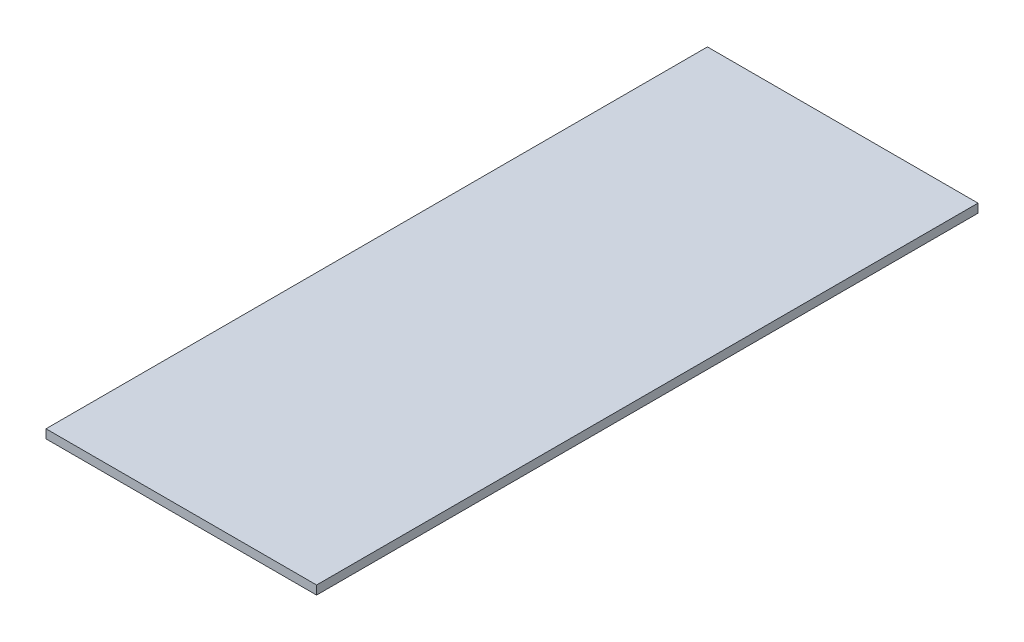
ISO-10303-21;
HEADER;
FILE_DESCRIPTION(('STEP AP214'),'2;1');
FILE_NAME('part.step','',(''),(''),'','','');
FILE_SCHEMA(('AUTOMOTIVE_DESIGN { 1 0 10303 214 1 1 1 1 }'));
ENDSEC;
DATA;
#1=APPLICATION_CONTEXT('core data for automotive mechanical design processes');
#2=APPLICATION_PROTOCOL_DEFINITION('international standard','automotive_design',2000,#1);
#3=PRODUCT_CONTEXT('',#1,'mechanical');
#4=PRODUCT('Part','Part','',(#3));
#5=PRODUCT_RELATED_PRODUCT_CATEGORY('part','',(#4));
#6=PRODUCT_DEFINITION_FORMATION('','',#4);
#7=PRODUCT_DEFINITION_CONTEXT('part definition',#1,'design');
#8=PRODUCT_DEFINITION('design','',#6,#7);
#9=PRODUCT_DEFINITION_SHAPE('','',#8);
#10=(LENGTH_UNIT() NAMED_UNIT(*) SI_UNIT(.MILLI.,.METRE.));
#11=(NAMED_UNIT(*) PLANE_ANGLE_UNIT() SI_UNIT($,.RADIAN.));
#12=(NAMED_UNIT(*) SI_UNIT($,.STERADIAN.) SOLID_ANGLE_UNIT());
#13=UNCERTAINTY_MEASURE_WITH_UNIT(LENGTH_MEASURE(1.E-05),#10,'distance_accuracy_value','');
#14=(GEOMETRIC_REPRESENTATION_CONTEXT(3) GLOBAL_UNCERTAINTY_ASSIGNED_CONTEXT((#13)) GLOBAL_UNIT_ASSIGNED_CONTEXT((#10,
#11,#12)) REPRESENTATION_CONTEXT('',''));
#15=CARTESIAN_POINT('',(0.,0.,0.));
#16=DIRECTION('',(0.,0.,1.));
#17=DIRECTION('',(1.,0.,0.));
#18=AXIS2_PLACEMENT_3D('',#15,#16,#17);
#19=CARTESIAN_POINT('',(85.725,5.55625,-209.55));
#20=DIRECTION('',(-1.,0.,0.));
#21=DIRECTION('',(0.,0.,1.));
#22=AXIS2_PLACEMENT_3D('',#19,#20,#21);
#23=PLANE('',#22);
#24=DIRECTION('',(0.,0.,-1.));
#25=VECTOR('',#24,1.);
#26=CARTESIAN_POINT('',(85.725,0.,-209.55));
#27=LINE('',#26,#25);
#28=CARTESIAN_POINT('',(85.725,0.,209.55));
#29=VERTEX_POINT('',#28);
#30=CARTESIAN_POINT('',(85.725,0.,-209.55));
#31=VERTEX_POINT('',#30);
#32=EDGE_CURVE('E110',#29,#31,#27,.T.);
#33=ORIENTED_EDGE('',*,*,#32,.T.);
#34=DIRECTION('',(0.,-1.,0.));
#35=VECTOR('',#34,1.);
#36=CARTESIAN_POINT('',(85.725,5.55625,-209.55));
#37=LINE('',#36,#35);
#38=CARTESIAN_POINT('',(85.725,5.55625,-209.55));
#39=VERTEX_POINT('',#38);
#40=EDGE_CURVE('E11',#39,#31,#37,.T.);
#41=ORIENTED_EDGE('',*,*,#40,.F.);
#42=DIRECTION('',(0.,0.,-1.));
#43=VECTOR('',#42,1.);
#44=CARTESIAN_POINT('',(85.725,5.55625,-209.55));
#45=LINE('',#44,#43);
#46=CARTESIAN_POINT('',(85.725,5.55625,209.55));
#47=VERTEX_POINT('',#46);
#48=EDGE_CURVE('E93',#47,#39,#45,.T.);
#49=ORIENTED_EDGE('',*,*,#48,.F.);
#50=DIRECTION('',(0.,-1.,0.));
#51=VECTOR('',#50,1.);
#52=CARTESIAN_POINT('',(85.725,5.55625,209.55));
#53=LINE('',#52,#51);
#54=EDGE_CURVE('E106',#47,#29,#53,.T.);
#55=ORIENTED_EDGE('',*,*,#54,.T.);
#56=EDGE_LOOP('',(#33,#41,#49,#55));
#57=FACE_BOUND('',#56,.T.);
#58=ADVANCED_FACE('F41',(#57),#23,.F.);
#59=CARTESIAN_POINT('',(-85.725,5.55625,-209.55));
#60=DIRECTION('',(0.,0.,1.));
#61=DIRECTION('',(1.,0.,0.));
#62=AXIS2_PLACEMENT_3D('',#59,#60,#61);
#63=PLANE('',#62);
#64=DIRECTION('',(-1.,0.,0.));
#65=VECTOR('',#64,1.);
#66=CARTESIAN_POINT('',(-85.725,0.,-209.55));
#67=LINE('',#66,#65);
#68=CARTESIAN_POINT('',(-85.725,0.,-209.55));
#69=VERTEX_POINT('',#68);
#70=EDGE_CURVE('E98',#31,#69,#67,.T.);
#71=ORIENTED_EDGE('',*,*,#70,.T.);
#72=DIRECTION('',(0.,-1.,0.));
#73=VECTOR('',#72,1.);
#74=CARTESIAN_POINT('',(-85.725,5.55625,-209.55));
#75=LINE('',#74,#73);
#76=CARTESIAN_POINT('',(-85.725,5.55625,-209.55));
#77=VERTEX_POINT('',#76);
#78=EDGE_CURVE('E50',#77,#69,#75,.T.);
#79=ORIENTED_EDGE('',*,*,#78,.F.);
#80=DIRECTION('',(-1.,0.,0.));
#81=VECTOR('',#80,1.);
#82=CARTESIAN_POINT('',(-85.725,5.55625,-209.55));
#83=LINE('',#82,#81);
#84=EDGE_CURVE('E88',#39,#77,#83,.T.);
#85=ORIENTED_EDGE('',*,*,#84,.F.);
#86=ORIENTED_EDGE('',*,*,#40,.T.);
#87=EDGE_LOOP('',(#71,#79,#85,#86));
#88=FACE_BOUND('',#87,.T.);
#89=ADVANCED_FACE('F97',(#88),#63,.F.);
#90=CARTESIAN_POINT('',(-85.725,5.55625,-209.55));
#91=DIRECTION('',(1.,0.,0.));
#92=DIRECTION('',(0.,0.,-1.));
#93=AXIS2_PLACEMENT_3D('',#90,#91,#92);
#94=PLANE('',#93);
#95=DIRECTION('',(0.,0.,1.));
#96=VECTOR('',#95,1.);
#97=CARTESIAN_POINT('',(-85.725,0.,-209.55));
#98=LINE('',#97,#96);
#99=CARTESIAN_POINT('',(-85.725,0.,209.55));
#100=VERTEX_POINT('',#99);
#101=EDGE_CURVE('E75',#69,#100,#98,.T.);
#102=ORIENTED_EDGE('',*,*,#101,.T.);
#103=DIRECTION('',(0.,-1.,0.));
#104=VECTOR('',#103,1.);
#105=CARTESIAN_POINT('',(-85.725,5.55625,209.55));
#106=LINE('',#105,#104);
#107=CARTESIAN_POINT('',(-85.725,5.55625,209.55));
#108=VERTEX_POINT('',#107);
#109=EDGE_CURVE('E100',#108,#100,#106,.T.);
#110=ORIENTED_EDGE('',*,*,#109,.F.);
#111=DIRECTION('',(0.,0.,1.));
#112=VECTOR('',#111,1.);
#113=CARTESIAN_POINT('',(-85.725,5.55625,-209.55));
#114=LINE('',#113,#112);
#115=EDGE_CURVE('E91',#77,#108,#114,.T.);
#116=ORIENTED_EDGE('',*,*,#115,.F.);
#117=ORIENTED_EDGE('',*,*,#78,.T.);
#118=EDGE_LOOP('',(#102,#110,#116,#117));
#119=FACE_BOUND('',#118,.T.);
#120=ADVANCED_FACE('F101',(#119),#94,.F.);
#121=CARTESIAN_POINT('',(-85.725,5.55625,209.55));
#122=DIRECTION('',(0.,0.,-1.));
#123=DIRECTION('',(-1.,0.,0.));
#124=AXIS2_PLACEMENT_3D('',#121,#122,#123);
#125=PLANE('',#124);
#126=DIRECTION('',(1.,0.,0.));
#127=VECTOR('',#126,1.);
#128=CARTESIAN_POINT('',(-85.725,0.,209.55));
#129=LINE('',#128,#127);
#130=EDGE_CURVE('E81',#100,#29,#129,.T.);
#131=ORIENTED_EDGE('',*,*,#130,.T.);
#132=ORIENTED_EDGE('',*,*,#54,.F.);
#133=DIRECTION('',(1.,0.,0.));
#134=VECTOR('',#133,1.);
#135=CARTESIAN_POINT('',(-85.725,5.55625,209.55));
#136=LINE('',#135,#134);
#137=EDGE_CURVE('E58',#108,#47,#136,.T.);
#138=ORIENTED_EDGE('',*,*,#137,.F.);
#139=ORIENTED_EDGE('',*,*,#109,.T.);
#140=EDGE_LOOP('',(#131,#132,#138,#139));
#141=FACE_BOUND('',#140,.T.);
#142=ADVANCED_FACE('F124',(#141),#125,.F.);
#143=CARTESIAN_POINT('',(0.,5.55625,0.));
#144=DIRECTION('',(0.,1.,0.));
#145=DIRECTION('',(0.,0.,1.));
#146=AXIS2_PLACEMENT_3D('',#143,#144,#145);
#147=PLANE('',#146);
#148=ORIENTED_EDGE('',*,*,#48,.T.);
#149=ORIENTED_EDGE('',*,*,#84,.T.);
#150=ORIENTED_EDGE('',*,*,#115,.T.);
#151=ORIENTED_EDGE('',*,*,#137,.T.);
#152=EDGE_LOOP('',(#148,#149,#150,#151));
#153=FACE_BOUND('',#152,.T.);
#154=ADVANCED_FACE('F89',(#153),#147,.T.);
#155=CARTESIAN_POINT('',(0.,0.,0.));
#156=DIRECTION('',(0.,1.,0.));
#157=DIRECTION('',(0.,0.,1.));
#158=AXIS2_PLACEMENT_3D('',#155,#156,#157);
#159=PLANE('',#158);
#160=ORIENTED_EDGE('',*,*,#32,.F.);
#161=ORIENTED_EDGE('',*,*,#130,.F.);
#162=ORIENTED_EDGE('',*,*,#101,.F.);
#163=ORIENTED_EDGE('',*,*,#70,.F.);
#164=EDGE_LOOP('',(#160,#161,#162,#163));
#165=FACE_BOUND('',#164,.T.);
#166=ADVANCED_FACE('F127',(#165),#159,.F.);
#167=CLOSED_SHELL('',(#58,#89,#120,#142,#154,#166));
#168=MANIFOLD_SOLID_BREP('B2',#167);
#169=ADVANCED_BREP_SHAPE_REPRESENTATION('',(#18,#168),#14);
#170=SHAPE_DEFINITION_REPRESENTATION(#9,#169);
ENDSEC;
END-ISO-10303-21;
